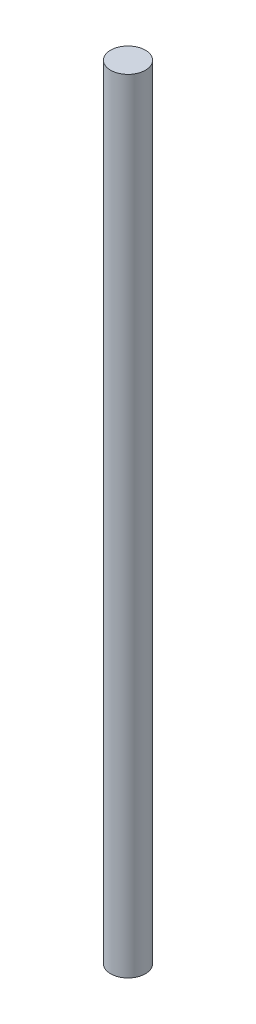
ISO-10303-21;
HEADER;
FILE_DESCRIPTION(('STEP AP214'),'2;1');
FILE_NAME('part.step','',(''),(''),'','','');
FILE_SCHEMA(('AUTOMOTIVE_DESIGN { 1 0 10303 214 1 1 1 1 }'));
ENDSEC;
DATA;
#1=APPLICATION_CONTEXT('core data for automotive mechanical design processes');
#2=APPLICATION_PROTOCOL_DEFINITION('international standard','automotive_design',2000,#1);
#3=PRODUCT_CONTEXT('',#1,'mechanical');
#4=PRODUCT('Part','Part','',(#3));
#5=PRODUCT_RELATED_PRODUCT_CATEGORY('part','',(#4));
#6=PRODUCT_DEFINITION_FORMATION('','',#4);
#7=PRODUCT_DEFINITION_CONTEXT('part definition',#1,'design');
#8=PRODUCT_DEFINITION('design','',#6,#7);
#9=PRODUCT_DEFINITION_SHAPE('','',#8);
#10=(LENGTH_UNIT() NAMED_UNIT(*) SI_UNIT(.MILLI.,.METRE.));
#11=(NAMED_UNIT(*) PLANE_ANGLE_UNIT() SI_UNIT($,.RADIAN.));
#12=(NAMED_UNIT(*) SI_UNIT($,.STERADIAN.) SOLID_ANGLE_UNIT());
#13=UNCERTAINTY_MEASURE_WITH_UNIT(LENGTH_MEASURE(1.E-05),#10,'distance_accuracy_value','');
#14=(GEOMETRIC_REPRESENTATION_CONTEXT(3) GLOBAL_UNCERTAINTY_ASSIGNED_CONTEXT((#13)) GLOBAL_UNIT_ASSIGNED_CONTEXT((#10,
#11,#12)) REPRESENTATION_CONTEXT('',''));
#15=CARTESIAN_POINT('',(0.,0.,0.));
#16=DIRECTION('',(0.,0.,1.));
#17=DIRECTION('',(1.,0.,0.));
#18=AXIS2_PLACEMENT_3D('',#15,#16,#17);
#19=CARTESIAN_POINT('',(0.,90.,0.));
#20=DIRECTION('',(0.,-1.,0.));
#21=DIRECTION('',(0.,0.,-1.));
#22=AXIS2_PLACEMENT_3D('',#19,#20,#21);
#23=CYLINDRICAL_SURFACE('',#22,2.);
#24=CARTESIAN_POINT('',(0.,90.,0.));
#25=DIRECTION('',(0.,1.,0.));
#26=DIRECTION('',(0.,0.,1.));
#27=AXIS2_PLACEMENT_3D('',#24,#25,#26);
#28=CIRCLE('',#27,2.);
#29=CARTESIAN_POINT('',(0.,90.,-2.));
#30=VERTEX_POINT('',#29);
#31=EDGE_CURVE('E10',#30,#30,#28,.T.);
#32=CARTESIAN_POINT('',(0.,0.,0.));
#33=DIRECTION('',(0.,1.,0.));
#34=DIRECTION('',(0.,0.,1.));
#35=AXIS2_PLACEMENT_3D('',#32,#33,#34);
#36=CIRCLE('',#35,2.);
#37=CARTESIAN_POINT('',(0.,0.,-2.));
#38=VERTEX_POINT('',#37);
#39=EDGE_CURVE('E37',#38,#38,#36,.T.);
#40=CARTESIAN_POINT('',(0.,90.,-2.));
#41=CARTESIAN_POINT('',(0.,89.0625,-2.));
#42=CARTESIAN_POINT('',(0.,88.125,-2.));
#43=CARTESIAN_POINT('',(0.,86.25,-2.));
#44=CARTESIAN_POINT('',(0.,85.3125,-2.));
#45=CARTESIAN_POINT('',(0.,83.4375,-2.));
#46=CARTESIAN_POINT('',(0.,82.5,-2.));
#47=CARTESIAN_POINT('',(0.,80.625,-2.));
#48=CARTESIAN_POINT('',(0.,79.6875,-2.));
#49=CARTESIAN_POINT('',(0.,77.8125,-2.));
#50=CARTESIAN_POINT('',(0.,76.875,-2.));
#51=CARTESIAN_POINT('',(0.,75.,-2.));
#52=CARTESIAN_POINT('',(0.,74.0625,-2.));
#53=CARTESIAN_POINT('',(0.,72.1875,-2.));
#54=CARTESIAN_POINT('',(0.,71.25,-2.));
#55=CARTESIAN_POINT('',(0.,69.375,-2.));
#56=CARTESIAN_POINT('',(0.,68.4375,-2.));
#57=CARTESIAN_POINT('',(0.,66.5625,-2.));
#58=CARTESIAN_POINT('',(0.,65.625,-2.));
#59=CARTESIAN_POINT('',(0.,63.75,-2.));
#60=CARTESIAN_POINT('',(0.,62.8125,-2.));
#61=CARTESIAN_POINT('',(0.,60.9375,-2.));
#62=CARTESIAN_POINT('',(0.,60.,-2.));
#63=CARTESIAN_POINT('',(0.,58.125,-2.));
#64=CARTESIAN_POINT('',(0.,57.1875,-2.));
#65=CARTESIAN_POINT('',(0.,55.3125,-2.));
#66=CARTESIAN_POINT('',(0.,54.375,-2.));
#67=CARTESIAN_POINT('',(0.,52.5,-2.));
#68=CARTESIAN_POINT('',(0.,51.5625,-2.));
#69=CARTESIAN_POINT('',(0.,49.6875,-2.));
#70=CARTESIAN_POINT('',(0.,48.75,-2.));
#71=CARTESIAN_POINT('',(0.,46.875,-2.));
#72=CARTESIAN_POINT('',(0.,45.9375,-2.));
#73=CARTESIAN_POINT('',(0.,44.0625,-2.));
#74=CARTESIAN_POINT('',(0.,43.125,-2.));
#75=CARTESIAN_POINT('',(0.,41.25,-2.));
#76=CARTESIAN_POINT('',(0.,40.3125,-2.));
#77=CARTESIAN_POINT('',(0.,38.4375,-2.));
#78=CARTESIAN_POINT('',(0.,37.5,-2.));
#79=CARTESIAN_POINT('',(0.,35.625,-2.));
#80=CARTESIAN_POINT('',(0.,34.6875,-2.));
#81=CARTESIAN_POINT('',(0.,32.8125,-2.));
#82=CARTESIAN_POINT('',(0.,31.875,-2.));
#83=CARTESIAN_POINT('',(0.,30.,-2.));
#84=CARTESIAN_POINT('',(0.,29.0625,-2.));
#85=CARTESIAN_POINT('',(0.,27.1875,-2.));
#86=CARTESIAN_POINT('',(0.,26.25,-2.));
#87=CARTESIAN_POINT('',(0.,24.375,-2.));
#88=CARTESIAN_POINT('',(0.,23.4375,-2.));
#89=CARTESIAN_POINT('',(0.,21.5625,-2.));
#90=CARTESIAN_POINT('',(0.,20.625,-2.));
#91=CARTESIAN_POINT('',(0.,18.75,-2.));
#92=CARTESIAN_POINT('',(0.,17.8125,-2.));
#93=CARTESIAN_POINT('',(0.,15.9375,-2.));
#94=CARTESIAN_POINT('',(0.,15.,-2.));
#95=CARTESIAN_POINT('',(0.,13.125,-2.));
#96=CARTESIAN_POINT('',(0.,12.1875,-2.));
#97=CARTESIAN_POINT('',(0.,10.3125,-2.));
#98=CARTESIAN_POINT('',(0.,9.37499999999999,-2.));
#99=CARTESIAN_POINT('',(0.,7.49999999999999,-2.));
#100=CARTESIAN_POINT('',(0.,6.56249999999999,-2.));
#101=CARTESIAN_POINT('',(0.,4.68749999999999,-2.));
#102=CARTESIAN_POINT('',(0.,3.74999999999998,-2.));
#103=CARTESIAN_POINT('',(0.,1.87499999999998,-2.));
#104=CARTESIAN_POINT('',(0.,0.937499999999986,-2.));
#105=CARTESIAN_POINT('',(0.,0.,-2.));
#106=B_SPLINE_CURVE_WITH_KNOTS('',3,(#40,#41,#42,#43,#44,#45,#46,#47,#48,#49,#50,#51,#52,#53,
#54,#55,#56,#57,#58,#59,#60,#61,#62,#63,#64,#65,#66,#67,#68,#69,#70,#71,#72,#73,#74,#75,#76,#77,
#78,#79,#80,#81,#82,#83,#84,#85,#86,#87,#88,#89,#90,#91,#92,#93,#94,#95,#96,#97,#98,#99,#100,
#101,#102,#103,#104,#105),.UNSPECIFIED.,.F.,.F.,(4,2,2,2,2,2,2,2,2,2,2,2,2,2,2,2,2,2,2,2,2,2,2,
2,2,2,2,2,2,2,2,2,4),(0.,2.8125,5.62499999999999,8.43749999999999,11.25,14.0625,16.875,19.6875,
22.5,25.3125,28.125,30.9375,33.75,36.5625,39.375,42.1875,45.,47.8125,50.625,53.4375,56.25,
59.0625,61.875,64.6875,67.5,70.3125,73.125,75.9375,78.75,81.5625,84.375,87.1875,90.),.UNSPECIFIED.);
#107=EDGE_CURVE('BSEAM34',#30,#38,#106,.T.);
#108=ORIENTED_EDGE('',*,*,#31,.F.);
#109=ORIENTED_EDGE('',*,*,#39,.T.);
#110=ORIENTED_EDGE('',*,*,#107,.T.);
#111=ORIENTED_EDGE('',*,*,#107,.F.);
#112=EDGE_LOOP('',(#108,#110,#109,#111));
#113=FACE_BOUND('',#112,.T.);
#114=ADVANCED_FACE('F34',(#113),#23,.T.);
#115=CARTESIAN_POINT('',(0.,90.,0.));
#116=DIRECTION('',(0.,1.,0.));
#117=DIRECTION('',(0.,0.,1.));
#118=AXIS2_PLACEMENT_3D('',#115,#116,#117);
#119=PLANE('',#118);
#120=ORIENTED_EDGE('',*,*,#31,.T.);
#121=EDGE_LOOP('',(#120));
#122=FACE_BOUND('',#121,.T.);
#123=ADVANCED_FACE('F49',(#122),#119,.T.);
#124=CARTESIAN_POINT('',(0.,0.,0.));
#125=DIRECTION('',(0.,1.,0.));
#126=DIRECTION('',(0.,0.,1.));
#127=AXIS2_PLACEMENT_3D('',#124,#125,#126);
#128=PLANE('',#127);
#129=ORIENTED_EDGE('',*,*,#39,.F.);
#130=EDGE_LOOP('',(#129));
#131=FACE_BOUND('',#130,.T.);
#132=ADVANCED_FACE('F47',(#131),#128,.F.);
#133=CLOSED_SHELL('',(#114,#123,#132));
#134=MANIFOLD_SOLID_BREP('B2',#133);
#135=ADVANCED_BREP_SHAPE_REPRESENTATION('',(#18,#134),#14);
#136=SHAPE_DEFINITION_REPRESENTATION(#9,#135);
ENDSEC;
END-ISO-10303-21;
